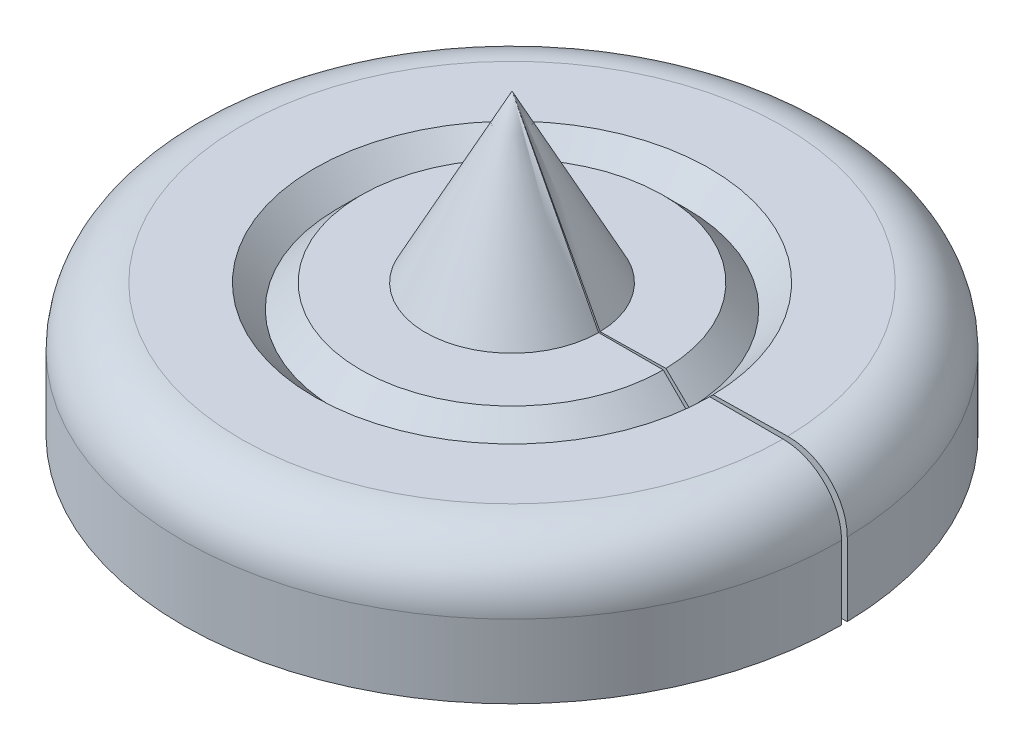
ISO-10303-21;
HEADER;
FILE_DESCRIPTION(('STEP AP214'),'2;1');
FILE_NAME('part.step','',(''),(''),'','','');
FILE_SCHEMA(('AUTOMOTIVE_DESIGN { 1 0 10303 214 1 1 1 1 }'));
ENDSEC;
DATA;
#1=APPLICATION_CONTEXT('core data for automotive mechanical design processes');
#2=APPLICATION_PROTOCOL_DEFINITION('international standard','automotive_design',2000,#1);
#3=PRODUCT_CONTEXT('',#1,'mechanical');
#4=PRODUCT('Part','Part','',(#3));
#5=PRODUCT_RELATED_PRODUCT_CATEGORY('part','',(#4));
#6=PRODUCT_DEFINITION_FORMATION('','',#4);
#7=PRODUCT_DEFINITION_CONTEXT('part definition',#1,'design');
#8=PRODUCT_DEFINITION('design','',#6,#7);
#9=PRODUCT_DEFINITION_SHAPE('','',#8);
#10=(LENGTH_UNIT() NAMED_UNIT(*) SI_UNIT(.MILLI.,.METRE.));
#11=(NAMED_UNIT(*) PLANE_ANGLE_UNIT() SI_UNIT($,.RADIAN.));
#12=(NAMED_UNIT(*) SI_UNIT($,.STERADIAN.) SOLID_ANGLE_UNIT());
#13=UNCERTAINTY_MEASURE_WITH_UNIT(LENGTH_MEASURE(1.E-05),#10,'distance_accuracy_value','');
#14=(GEOMETRIC_REPRESENTATION_CONTEXT(3) GLOBAL_UNCERTAINTY_ASSIGNED_CONTEXT((#13)) GLOBAL_UNIT_ASSIGNED_CONTEXT((#10,
#11,#12)) REPRESENTATION_CONTEXT('',''));
#15=CARTESIAN_POINT('',(0.,0.,0.));
#16=DIRECTION('',(0.,0.,1.));
#17=DIRECTION('',(1.,0.,0.));
#18=AXIS2_PLACEMENT_3D('',#15,#16,#17);
#19=CARTESIAN_POINT('',(0.,50.8,0.));
#20=DIRECTION('',(0.,-1.,0.));
#21=DIRECTION('',(1.,0.,0.));
#22=AXIS2_PLACEMENT_3D('',#19,#20,#21);
#23=CONICAL_SURFACE('',#22,33.3690664043957,0.480995119443733);
#24=DIRECTION('',(-0.462661612648625,0.886534958239873,0.));
#25=VECTOR('',#24,1.);
#26=CARTESIAN_POINT('',(33.3690664043957,50.8,0.));
#27=LINE('',#26,#25);
#28=CARTESIAN_POINT('',(33.3690664043957,50.8,0.));
#29=VERTEX_POINT('',#28);
#30=CARTESIAN_POINT('',(0.,114.74056278404,0.));
#31=VERTEX_POINT('',#30);
#32=EDGE_CURVE('E122',#29,#31,#27,.T.);
#33=ORIENTED_EDGE('',*,*,#32,.T.);
#34=DIRECTION('',(-0.462591147044067,0.886534958239873,0.00807455850686587));
#35=VECTOR('',#34,1.);
#36=CARTESIAN_POINT('',(33.3639841339556,50.8,-0.582370509321714));
#37=LINE('',#36,#35);
#38=CARTESIAN_POINT('',(33.3639841339556,50.8,-0.582370509321714));
#39=VERTEX_POINT('',#38);
#40=EDGE_CURVE('E146',#39,#31,#37,.T.);
#41=ORIENTED_EDGE('',*,*,#40,.F.);
#42=CARTESIAN_POINT('',(0.,50.8,0.));
#43=DIRECTION('',(0.,1.,0.));
#44=DIRECTION('',(-1.,0.,0.));
#45=AXIS2_PLACEMENT_3D('',#42,#43,#44);
#46=CIRCLE('',#45,33.3690664043957);
#47=EDGE_CURVE('E51',#39,#29,#46,.T.);
#48=ORIENTED_EDGE('',*,*,#47,.T.);
#49=EDGE_LOOP('',(#33,#41,#48));
#50=FACE_BOUND('',#49,.T.);
#51=ADVANCED_FACE('F36',(#50),#23,.T.);
#52=CARTESIAN_POINT('',(0.,0.,0.));
#53=DIRECTION('',(0.,-1.,0.));
#54=DIRECTION('',(1.,0.,0.));
#55=AXIS2_PLACEMENT_3D('',#52,#53,#54);
#56=CONICAL_SURFACE('',#55,25.4,0.785398163397448);
#57=CARTESIAN_POINT('',(0.,0.,0.));
#58=DIRECTION('',(0.,1.,0.));
#59=DIRECTION('',(-1.,0.,0.));
#60=AXIS2_PLACEMENT_3D('',#57,#58,#59);
#61=CIRCLE('',#60,25.4);
#62=CARTESIAN_POINT('',(25.3961314569723,0.,-0.443291123506619));
#63=VERTEX_POINT('',#62);
#64=CARTESIAN_POINT('',(25.4,0.,0.));
#65=VERTEX_POINT('',#64);
#66=EDGE_CURVE('E11',#63,#65,#61,.T.);
#67=ORIENTED_EDGE('',*,*,#66,.F.);
#68=DIRECTION('',(-0.706999085398824,0.707106781186547,0.0123407149398163));
#69=VECTOR('',#68,1.);
#70=CARTESIAN_POINT('',(25.3961314569723,0.,-0.443291123506619));
#71=LINE('',#70,#69);
#72=CARTESIAN_POINT('',(0.,25.4,0.));
#73=VERTEX_POINT('',#72);
#74=EDGE_CURVE('E119',#63,#73,#71,.T.);
#75=ORIENTED_EDGE('',*,*,#74,.T.);
#76=DIRECTION('',(-0.707106781186547,0.707106781186547,0.));
#77=VECTOR('',#76,1.);
#78=CARTESIAN_POINT('',(25.4,0.,0.));
#79=LINE('',#78,#77);
#80=EDGE_CURVE('E118',#65,#73,#79,.T.);
#81=ORIENTED_EDGE('',*,*,#80,.F.);
#82=EDGE_LOOP('',(#67,#75,#81));
#83=FACE_BOUND('',#82,.T.);
#84=ADVANCED_FACE('F38',(#83),#56,.F.);
#85=CARTESIAN_POINT('',(25.3961314569723,0.,-0.443291123506619));
#86=DIRECTION('',(0.,1.,0.));
#87=DIRECTION('',(-1.,0.,0.));
#88=AXIS2_PLACEMENT_3D('',#85,#86,#87);
#89=PLANE('',#88);
#90=CARTESIAN_POINT('',(0.,0.,0.));
#91=DIRECTION('',(0.,1.,0.));
#92=DIRECTION('',(-1.,0.,0.));
#93=AXIS2_PLACEMENT_3D('',#90,#91,#92);
#94=CIRCLE('',#93,127.);
#95=CARTESIAN_POINT('',(126.980657284862,0.,-2.2164556175331));
#96=VERTEX_POINT('',#95);
#97=CARTESIAN_POINT('',(127.,0.,0.));
#98=VERTEX_POINT('',#97);
#99=EDGE_CURVE('E44',#96,#98,#94,.T.);
#100=ORIENTED_EDGE('',*,*,#99,.F.);
#101=DIRECTION('',(0.999847695156391,0.,-0.0174524064372685));
#102=VECTOR('',#101,1.);
#103=CARTESIAN_POINT('',(25.3961314569723,0.,-0.443291123506619));
#104=LINE('',#103,#102);
#105=EDGE_CURVE('E114',#63,#96,#104,.T.);
#106=ORIENTED_EDGE('',*,*,#105,.F.);
#107=ORIENTED_EDGE('',*,*,#66,.T.);
#108=DIRECTION('',(1.,0.,0.));
#109=VECTOR('',#108,1.);
#110=CARTESIAN_POINT('',(25.4,0.,0.));
#111=LINE('',#110,#109);
#112=EDGE_CURVE('E111',#65,#98,#111,.T.);
#113=ORIENTED_EDGE('',*,*,#112,.T.);
#114=EDGE_LOOP('',(#100,#106,#107,#113));
#115=FACE_BOUND('',#114,.T.);
#116=ADVANCED_FACE('F109',(#115),#89,.F.);
#117=CARTESIAN_POINT('',(0.,25.4,0.));
#118=DIRECTION('',(0.,1.,0.));
#119=DIRECTION('',(-1.,0.,0.));
#120=AXIS2_PLACEMENT_3D('',#117,#118,#119);
#121=CYLINDRICAL_SURFACE('',#120,127.);
#122=CARTESIAN_POINT('',(0.,28.2410961876788,0.));
#123=DIRECTION('',(0.,1.,0.));
#124=DIRECTION('',(-1.,0.,0.));
#125=AXIS2_PLACEMENT_3D('',#122,#123,#124);
#126=CIRCLE('',#125,127.);
#127=CARTESIAN_POINT('',(126.980657284862,28.2410961876788,-2.2164556175331));
#128=VERTEX_POINT('',#127);
#129=CARTESIAN_POINT('',(127.,28.2410961876788,0.));
#130=VERTEX_POINT('',#129);
#131=EDGE_CURVE('E178',#128,#130,#126,.T.);
#132=ORIENTED_EDGE('',*,*,#131,.F.);
#133=DIRECTION('',(0.,1.,0.));
#134=VECTOR('',#133,1.);
#135=CARTESIAN_POINT('',(126.980657284862,0.,-2.2164556175331));
#136=LINE('',#135,#134);
#137=EDGE_CURVE('E153',#96,#128,#136,.T.);
#138=ORIENTED_EDGE('',*,*,#137,.F.);
#139=ORIENTED_EDGE('',*,*,#99,.T.);
#140=DIRECTION('',(0.,1.,0.));
#141=VECTOR('',#140,1.);
#142=CARTESIAN_POINT('',(127.,0.,0.));
#143=LINE('',#142,#141);
#144=EDGE_CURVE('E128',#98,#130,#143,.T.);
#145=ORIENTED_EDGE('',*,*,#144,.T.);
#146=EDGE_LOOP('',(#132,#138,#139,#145));
#147=FACE_BOUND('',#146,.T.);
#148=ADVANCED_FACE('F181',(#147),#121,.T.);
#149=CARTESIAN_POINT('',(0.,28.241096187679,0.));
#150=DIRECTION('',(0.,1.,0.));
#151=DIRECTION('',(-1.,0.,0.));
#152=AXIS2_PLACEMENT_3D('',#149,#150,#151);
#153=TOROIDAL_SURFACE('',#152,104.441096187679,22.558903812321);
#154=CARTESIAN_POINT('',(0.,50.8,0.));
#155=DIRECTION('',(0.,1.,0.));
#156=DIRECTION('',(-1.,0.,0.));
#157=AXIS2_PLACEMENT_3D('',#154,#155,#156);
#158=CIRCLE('',#157,104.441096187679);
#159=CARTESIAN_POINT('',(104.425189302858,50.8,-1.82274845942122));
#160=VERTEX_POINT('',#159);
#161=CARTESIAN_POINT('',(104.441096187679,50.8,0.));
#162=VERTEX_POINT('',#161);
#163=EDGE_CURVE('E176',#160,#162,#158,.T.);
#164=ORIENTED_EDGE('',*,*,#163,.F.);
#165=CARTESIAN_POINT('',(104.425189302858,28.241096187679,-1.82274845942122));
#166=DIRECTION('',(0.0174524064372685,0.,0.999847695156391));
#167=DIRECTION('',(0.999847695156391,0.,-0.0174524064372685));
#168=AXIS2_PLACEMENT_3D('',#165,#166,#167);
#169=CIRCLE('',#168,22.558903812321);
#170=EDGE_CURVE('E156',#128,#160,#169,.T.);
#171=ORIENTED_EDGE('',*,*,#170,.F.);
#172=ORIENTED_EDGE('',*,*,#131,.T.);
#173=CARTESIAN_POINT('',(104.441096187679,28.241096187679,0.));
#174=DIRECTION('',(0.,0.,1.));
#175=DIRECTION('',(1.,0.,0.));
#176=AXIS2_PLACEMENT_3D('',#173,#174,#175);
#177=CIRCLE('',#176,22.558903812321);
#178=EDGE_CURVE('E130',#130,#162,#177,.T.);
#179=ORIENTED_EDGE('',*,*,#178,.T.);
#180=EDGE_LOOP('',(#164,#171,#172,#179));
#181=FACE_BOUND('',#180,.T.);
#182=ADVANCED_FACE('F200',(#181),#153,.T.);
#183=CARTESIAN_POINT('',(104.425189302858,50.8,-1.82274845942122));
#184=DIRECTION('',(0.,-1.,0.));
#185=DIRECTION('',(1.,0.,0.));
#186=AXIS2_PLACEMENT_3D('',#183,#184,#185);
#187=PLANE('',#186);
#188=CARTESIAN_POINT('',(0.,50.8,0.));
#189=DIRECTION('',(0.,1.,0.));
#190=DIRECTION('',(-1.,0.,0.));
#191=AXIS2_PLACEMENT_3D('',#188,#189,#190);
#192=CIRCLE('',#191,76.2);
#193=CARTESIAN_POINT('',(76.188394370917,50.8,-1.32987337051986));
#194=VERTEX_POINT('',#193);
#195=CARTESIAN_POINT('',(76.2,50.8,0.));
#196=VERTEX_POINT('',#195);
#197=EDGE_CURVE('E174',#194,#196,#192,.T.);
#198=ORIENTED_EDGE('',*,*,#197,.F.);
#199=DIRECTION('',(-0.999847695156391,0.,0.0174524064372685));
#200=VECTOR('',#199,1.);
#201=CARTESIAN_POINT('',(104.425189302858,50.8,-1.82274845942122));
#202=LINE('',#201,#200);
#203=EDGE_CURVE('E159',#160,#194,#202,.T.);
#204=ORIENTED_EDGE('',*,*,#203,.F.);
#205=ORIENTED_EDGE('',*,*,#163,.T.);
#206=DIRECTION('',(-1.,0.,0.));
#207=VECTOR('',#206,1.);
#208=CARTESIAN_POINT('',(104.441096187679,50.8,0.));
#209=LINE('',#208,#207);
#210=EDGE_CURVE('E136',#162,#196,#209,.T.);
#211=ORIENTED_EDGE('',*,*,#210,.T.);
#212=EDGE_LOOP('',(#198,#204,#205,#211));
#213=FACE_BOUND('',#212,.T.);
#214=ADVANCED_FACE('F198',(#213),#187,.F.);
#215=CARTESIAN_POINT('',(0.,50.8,0.));
#216=DIRECTION('',(0.,1.,0.));
#217=DIRECTION('',(-1.,0.,0.));
#218=AXIS2_PLACEMENT_3D('',#215,#216,#217);
#219=CONICAL_SURFACE('',#218,76.2,0.785398163397448);
#220=CARTESIAN_POINT('',(0.,41.8464499898617,0.));
#221=DIRECTION('',(0.,1.,0.));
#222=DIRECTION('',(-1.,0.,0.));
#223=AXIS2_PLACEMENT_3D('',#220,#221,#222);
#224=CIRCLE('',#223,67.2464499898616);
#225=CARTESIAN_POINT('',(67.2362080298127,41.8464499898617,-1.17361237668651));
#226=VERTEX_POINT('',#225);
#227=CARTESIAN_POINT('',(67.2464499898616,41.8464499898617,0.));
#228=VERTEX_POINT('',#227);
#229=EDGE_CURVE('E172',#226,#228,#224,.T.);
#230=ORIENTED_EDGE('',*,*,#229,.F.);
#231=DIRECTION('',(-0.706999085398824,-0.707106781186548,0.0123407149398163));
#232=VECTOR('',#231,1.);
#233=CARTESIAN_POINT('',(76.188394370917,50.8,-1.32987337051986));
#234=LINE('',#233,#232);
#235=EDGE_CURVE('E162',#194,#226,#234,.T.);
#236=ORIENTED_EDGE('',*,*,#235,.F.);
#237=ORIENTED_EDGE('',*,*,#197,.T.);
#238=DIRECTION('',(-0.707106781186548,-0.707106781186548,0.));
#239=VECTOR('',#238,1.);
#240=CARTESIAN_POINT('',(76.2,50.8,0.));
#241=LINE('',#240,#239);
#242=EDGE_CURVE('E139',#196,#228,#241,.T.);
#243=ORIENTED_EDGE('',*,*,#242,.T.);
#244=EDGE_LOOP('',(#230,#236,#237,#243));
#245=FACE_BOUND('',#244,.T.);
#246=ADVANCED_FACE('F194',(#245),#219,.F.);
#247=CARTESIAN_POINT('',(0.,41.8464499898617,0.));
#248=DIRECTION('',(0.,-1.,0.));
#249=DIRECTION('',(1.,0.,0.));
#250=AXIS2_PLACEMENT_3D('',#247,#248,#249);
#251=CONICAL_SURFACE('',#250,67.2464499898616,0.785398163397448);
#252=CARTESIAN_POINT('',(0.,50.8,0.));
#253=DIRECTION('',(0.,1.,0.));
#254=DIRECTION('',(-1.,0.,0.));
#255=AXIS2_PLACEMENT_3D('',#252,#253,#254);
#256=CIRCLE('',#255,58.2928999797233);
#257=CARTESIAN_POINT('',(58.2840216887084,50.8,-1.01735138285317));
#258=VERTEX_POINT('',#257);
#259=CARTESIAN_POINT('',(58.2928999797233,50.8,0.));
#260=VERTEX_POINT('',#259);
#261=EDGE_CURVE('E59',#258,#260,#256,.T.);
#262=ORIENTED_EDGE('',*,*,#261,.F.);
#263=DIRECTION('',(-0.706999085398824,0.707106781186548,0.0123407149398163));
#264=VECTOR('',#263,1.);
#265=CARTESIAN_POINT('',(67.2362080298127,41.8464499898617,-1.17361237668651));
#266=LINE('',#265,#264);
#267=EDGE_CURVE('E165',#226,#258,#266,.T.);
#268=ORIENTED_EDGE('',*,*,#267,.F.);
#269=ORIENTED_EDGE('',*,*,#229,.T.);
#270=DIRECTION('',(-0.707106781186548,0.707106781186548,0.));
#271=VECTOR('',#270,1.);
#272=CARTESIAN_POINT('',(67.2464499898616,41.8464499898617,0.));
#273=LINE('',#272,#271);
#274=EDGE_CURVE('E142',#228,#260,#273,.T.);
#275=ORIENTED_EDGE('',*,*,#274,.T.);
#276=EDGE_LOOP('',(#262,#268,#269,#275));
#277=FACE_BOUND('',#276,.T.);
#278=ADVANCED_FACE('F190',(#277),#251,.T.);
#279=CARTESIAN_POINT('',(58.2840216887084,50.8,-1.01735138285317));
#280=DIRECTION('',(0.,-1.,0.));
#281=DIRECTION('',(1.,0.,0.));
#282=AXIS2_PLACEMENT_3D('',#279,#280,#281);
#283=PLANE('',#282);
#284=DIRECTION('',(-0.999847695156391,0.,0.0174524064372685));
#285=VECTOR('',#284,1.);
#286=CARTESIAN_POINT('',(58.2840216887084,50.8,-1.01735138285317));
#287=LINE('',#286,#285);
#288=EDGE_CURVE('E167',#258,#39,#287,.T.);
#289=ORIENTED_EDGE('',*,*,#288,.F.);
#290=ORIENTED_EDGE('',*,*,#261,.T.);
#291=DIRECTION('',(-1.,0.,0.));
#292=VECTOR('',#291,1.);
#293=CARTESIAN_POINT('',(58.2928999797233,50.8,0.));
#294=LINE('',#293,#292);
#295=EDGE_CURVE('E144',#260,#29,#294,.T.);
#296=ORIENTED_EDGE('',*,*,#295,.T.);
#297=ORIENTED_EDGE('',*,*,#47,.F.);
#298=EDGE_LOOP('',(#289,#290,#296,#297));
#299=FACE_BOUND('',#298,.T.);
#300=ADVANCED_FACE('F188',(#299),#283,.F.);
#301=CARTESIAN_POINT('',(104.425189302858,28.241096187679,-1.82274845942122));
#302=DIRECTION('',(0.0174524064372685,0.,0.999847695156391));
#303=DIRECTION('',(0.999847695156391,0.,-0.0174524064372685));
#304=AXIS2_PLACEMENT_3D('',#301,#302,#303);
#305=PLANE('',#304);
#306=ORIENTED_EDGE('',*,*,#40,.T.);
#307=DIRECTION('',(0.,-1.,0.));
#308=VECTOR('',#307,1.);
#309=CARTESIAN_POINT('',(0.,114.74056278404,0.));
#310=LINE('',#309,#308);
#311=EDGE_CURVE('E149',#31,#73,#310,.T.);
#312=ORIENTED_EDGE('',*,*,#311,.T.);
#313=ORIENTED_EDGE('',*,*,#74,.F.);
#314=ORIENTED_EDGE('',*,*,#105,.T.);
#315=ORIENTED_EDGE('',*,*,#137,.T.);
#316=ORIENTED_EDGE('',*,*,#170,.T.);
#317=ORIENTED_EDGE('',*,*,#203,.T.);
#318=ORIENTED_EDGE('',*,*,#235,.T.);
#319=ORIENTED_EDGE('',*,*,#267,.T.);
#320=ORIENTED_EDGE('',*,*,#288,.T.);
#321=EDGE_LOOP('',(#306,#312,#313,#314,#315,#316,#317,#318,#319,#320));
#322=FACE_BOUND('',#321,.T.);
#323=ADVANCED_FACE('F183',(#322),#305,.T.);
#324=CARTESIAN_POINT('',(104.441096187679,28.241096187679,0.));
#325=DIRECTION('',(0.,0.,1.));
#326=DIRECTION('',(1.,0.,0.));
#327=AXIS2_PLACEMENT_3D('',#324,#325,#326);
#328=PLANE('',#327);
#329=ORIENTED_EDGE('',*,*,#32,.F.);
#330=ORIENTED_EDGE('',*,*,#295,.F.);
#331=ORIENTED_EDGE('',*,*,#274,.F.);
#332=ORIENTED_EDGE('',*,*,#242,.F.);
#333=ORIENTED_EDGE('',*,*,#210,.F.);
#334=ORIENTED_EDGE('',*,*,#178,.F.);
#335=ORIENTED_EDGE('',*,*,#144,.F.);
#336=ORIENTED_EDGE('',*,*,#112,.F.);
#337=ORIENTED_EDGE('',*,*,#80,.T.);
#338=ORIENTED_EDGE('',*,*,#311,.F.);
#339=EDGE_LOOP('',(#329,#330,#331,#332,#333,#334,#335,#336,#337,#338));
#340=FACE_BOUND('',#339,.T.);
#341=ADVANCED_FACE('F125',(#340),#328,.F.);
#342=CLOSED_SHELL('',(#51,#84,#116,#148,#182,#214,#246,#278,#300,#323,#341));
#343=MANIFOLD_SOLID_BREP('B2',#342);
#344=ADVANCED_BREP_SHAPE_REPRESENTATION('',(#18,#343),#14);
#345=SHAPE_DEFINITION_REPRESENTATION(#9,#344);
ENDSEC;
END-ISO-10303-21;
